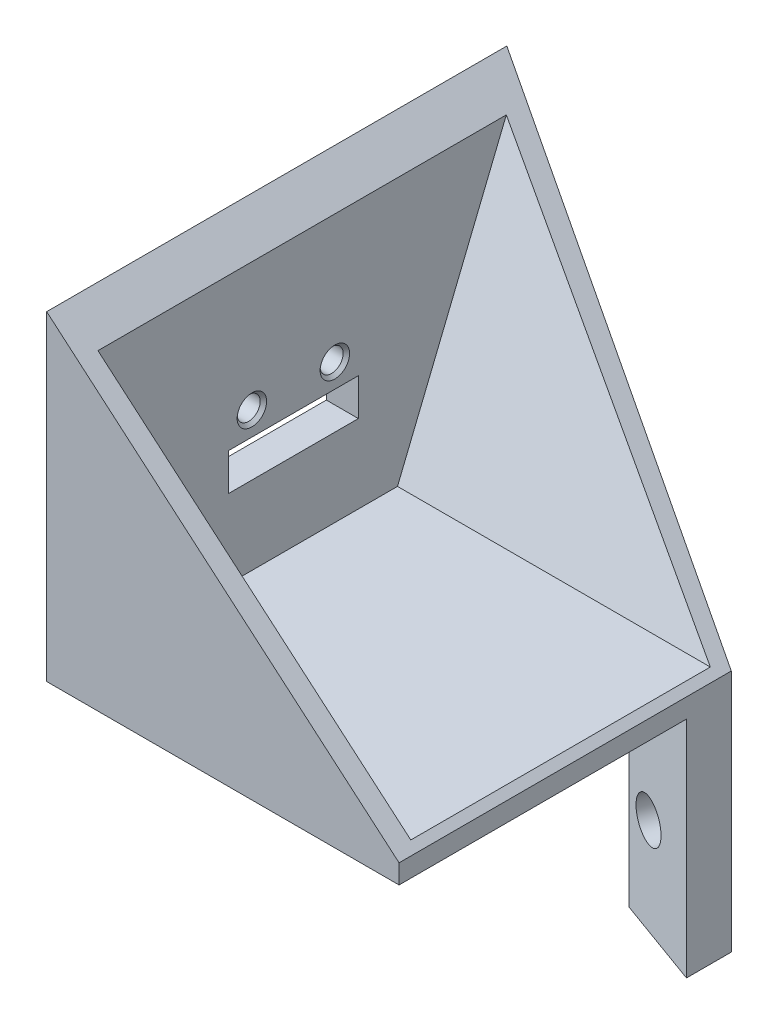
ISO-10303-21;
HEADER;
FILE_DESCRIPTION(('STEP AP214'),'2;1');
FILE_NAME('part.step','',(''),(''),'','','');
FILE_SCHEMA(('AUTOMOTIVE_DESIGN { 1 0 10303 214 1 1 1 1 }'));
ENDSEC;
DATA;
#1=APPLICATION_CONTEXT('core data for automotive mechanical design processes');
#2=APPLICATION_PROTOCOL_DEFINITION('international standard','automotive_design',2000,#1);
#3=PRODUCT_CONTEXT('',#1,'mechanical');
#4=PRODUCT('Part','Part','',(#3));
#5=PRODUCT_RELATED_PRODUCT_CATEGORY('part','',(#4));
#6=PRODUCT_DEFINITION_FORMATION('','',#4);
#7=PRODUCT_DEFINITION_CONTEXT('part definition',#1,'design');
#8=PRODUCT_DEFINITION('design','',#6,#7);
#9=PRODUCT_DEFINITION_SHAPE('','',#8);
#10=(LENGTH_UNIT() NAMED_UNIT(*) SI_UNIT(.MILLI.,.METRE.));
#11=(NAMED_UNIT(*) PLANE_ANGLE_UNIT() SI_UNIT($,.RADIAN.));
#12=(NAMED_UNIT(*) SI_UNIT($,.STERADIAN.) SOLID_ANGLE_UNIT());
#13=UNCERTAINTY_MEASURE_WITH_UNIT(LENGTH_MEASURE(1.E-05),#10,'distance_accuracy_value','');
#14=(GEOMETRIC_REPRESENTATION_CONTEXT(3) GLOBAL_UNCERTAINTY_ASSIGNED_CONTEXT((#13)) GLOBAL_UNIT_ASSIGNED_CONTEXT((#10,
#11,#12)) REPRESENTATION_CONTEXT('',''));
#15=CARTESIAN_POINT('',(0.,0.,0.));
#16=DIRECTION('',(0.,0.,1.));
#17=DIRECTION('',(1.,0.,0.));
#18=AXIS2_PLACEMENT_3D('',#15,#16,#17);
#19=CARTESIAN_POINT('',(1.66533453693773E-13,1183.83508709221,0.));
#20=DIRECTION('',(0.,-1.,0.));
#21=DIRECTION('',(0.,0.,-1.));
#22=AXIS2_PLACEMENT_3D('',#19,#20,#21);
#23=PLANE('',#22);
#24=DIRECTION('',(0.940018333102236,0.,0.341123926794492));
#25=VECTOR('',#24,1.);
#26=CARTESIAN_POINT('',(-154.707254334274,1183.83508709221,426.319128959078));
#27=LINE('',#26,#25);
#28=CARTESIAN_POINT('',(1320.51130130809,1183.83508709221,961.662248193849));
#29=VERTEX_POINT('',#28);
#30=CARTESIAN_POINT('',(1334.61157630462,1183.83508709221,966.779107095766));
#31=VERTEX_POINT('',#30);
#32=EDGE_CURVE('E186',#29,#31,#27,.T.);
#33=ORIENTED_EDGE('',*,*,#32,.T.);
#34=DIRECTION('',(0.,0.,-1.));
#35=VECTOR('',#34,1.);
#36=CARTESIAN_POINT('',(1334.61157630462,1183.83508709221,0.));
#37=LINE('',#36,#35);
#38=CARTESIAN_POINT('',(1334.61157630462,1183.83508709221,959.779107095766));
#39=VERTEX_POINT('',#38);
#40=EDGE_CURVE('E66',#31,#39,#37,.T.);
#41=ORIENTED_EDGE('',*,*,#40,.T.);
#42=DIRECTION('',(-0.940018333102236,0.,-0.341123926794492));
#43=VECTOR('',#42,1.);
#44=CARTESIAN_POINT('',(1375.51130130809,1183.83508709221,974.621237623107));
#45=LINE('',#44,#43);
#46=CARTESIAN_POINT('',(1361.41102631155,1183.83508709221,969.50437872119));
#47=VERTEX_POINT('',#46);
#48=EDGE_CURVE('E327',#47,#39,#45,.T.);
#49=ORIENTED_EDGE('',*,*,#48,.F.);
#50=DIRECTION('',(0.,0.,-1.));
#51=VECTOR('',#50,1.);
#52=CARTESIAN_POINT('',(1361.41102631155,1183.83508709221,0.));
#53=LINE('',#52,#51);
#54=CARTESIAN_POINT('',(1361.41102631155,1183.83508709221,976.50437872119));
#55=VERTEX_POINT('',#54);
#56=EDGE_CURVE('E71',#55,#47,#53,.T.);
#57=ORIENTED_EDGE('',*,*,#56,.F.);
#58=DIRECTION('',(-0.940018333102236,0.,-0.341123926794492));
#59=VECTOR('',#58,1.);
#60=CARTESIAN_POINT('',(-154.707254334274,1183.83508709221,426.319128959078));
#61=LINE('',#60,#59);
#62=CARTESIAN_POINT('',(1375.51130130809,1183.83508709221,981.621237623107));
#63=VERTEX_POINT('',#62);
#64=EDGE_CURVE('E180',#63,#55,#61,.T.);
#65=ORIENTED_EDGE('',*,*,#64,.F.);
#66=DIRECTION('',(0.,0.,-1.));
#67=VECTOR('',#66,1.);
#68=CARTESIAN_POINT('',(1375.51130130809,1183.83508709221,1026.47670177833));
#69=LINE('',#68,#67);
#70=CARTESIAN_POINT('',(1375.51130130809,1183.83508709221,1026.47670177833));
#71=VERTEX_POINT('',#70);
#72=EDGE_CURVE('E331',#71,#63,#69,.T.);
#73=ORIENTED_EDGE('',*,*,#72,.F.);
#74=DIRECTION('',(-1.,0.,0.));
#75=VECTOR('',#74,1.);
#76=CARTESIAN_POINT('',(1325.51130130809,1183.83508709221,1026.47670177833));
#77=LINE('',#76,#75);
#78=CARTESIAN_POINT('',(1320.51130130809,1183.83508709221,1026.47670177833));
#79=VERTEX_POINT('',#78);
#80=EDGE_CURVE('E329',#71,#79,#77,.T.);
#81=ORIENTED_EDGE('',*,*,#80,.T.);
#82=DIRECTION('',(0.,0.,-1.));
#83=VECTOR('',#82,1.);
#84=CARTESIAN_POINT('',(1320.51130130809,1183.83508709221,1026.47670177833));
#85=LINE('',#84,#83);
#86=EDGE_CURVE('E322',#79,#29,#85,.T.);
#87=ORIENTED_EDGE('',*,*,#86,.T.);
#88=EDGE_LOOP('',(#33,#41,#49,#57,#65,#73,#81,#87));
#89=FACE_BOUND('',#88,.T.);
#90=ADVANCED_FACE('F47',(#89),#23,.T.);
#91=CARTESIAN_POINT('',(1320.51130130809,1183.83508709221,1026.47670177833));
#92=DIRECTION('',(1.,0.,0.));
#93=DIRECTION('',(0.,1.,0.));
#94=AXIS2_PLACEMENT_3D('',#91,#92,#93);
#95=PLANE('',#94);
#96=DIRECTION('',(0.,0.,-1.));
#97=VECTOR('',#96,1.);
#98=CARTESIAN_POINT('',(1320.51130130809,1233.83508709221,1026.47670177833));
#99=LINE('',#98,#97);
#100=CARTESIAN_POINT('',(1320.51130130809,1233.83508709221,1026.47670177833));
#101=VERTEX_POINT('',#100);
#102=CARTESIAN_POINT('',(1320.51130130809,1233.83508709221,954.662248193849));
#103=VERTEX_POINT('',#102);
#104=EDGE_CURVE('E323',#101,#103,#99,.T.);
#105=ORIENTED_EDGE('',*,*,#104,.T.);
#106=DIRECTION('',(0.,-1.,0.));
#107=VECTOR('',#106,1.);
#108=CARTESIAN_POINT('',(1320.51130130809,1237.85655253535,954.662248193849));
#109=LINE('',#108,#107);
#110=CARTESIAN_POINT('',(1320.51130130809,1148.83508709221,954.662248193848));
#111=VERTEX_POINT('',#110);
#112=EDGE_CURVE('E245',#103,#111,#109,.T.);
#113=ORIENTED_EDGE('',*,*,#112,.T.);
#114=DIRECTION('',(0.,0.,-1.));
#115=VECTOR('',#114,1.);
#116=CARTESIAN_POINT('',(1320.51130130809,1148.83508709221,0.));
#117=LINE('',#116,#115);
#118=CARTESIAN_POINT('',(1320.51130130809,1148.83508709221,961.662248193849));
#119=VERTEX_POINT('',#118);
#120=EDGE_CURVE('E193',#119,#111,#117,.T.);
#121=ORIENTED_EDGE('',*,*,#120,.F.);
#122=DIRECTION('',(0.,1.,0.));
#123=VECTOR('',#122,1.);
#124=CARTESIAN_POINT('',(1320.51130130809,1148.83508709221,961.662248193849));
#125=LINE('',#124,#123);
#126=EDGE_CURVE('E178',#119,#29,#125,.T.);
#127=ORIENTED_EDGE('',*,*,#126,.T.);
#128=ORIENTED_EDGE('',*,*,#86,.F.);
#129=DIRECTION('',(0.,1.,0.));
#130=VECTOR('',#129,1.);
#131=CARTESIAN_POINT('',(1320.51130130809,1183.83508709221,1026.47670177833));
#132=LINE('',#131,#130);
#133=EDGE_CURVE('E339',#79,#101,#132,.T.);
#134=ORIENTED_EDGE('',*,*,#133,.T.);
#135=EDGE_LOOP('',(#105,#113,#121,#127,#128,#134));
#136=FACE_BOUND('',#135,.T.);
#137=CARTESIAN_POINT('',(1320.51130130809,1209.54235981948,986.501701778326));
#138=DIRECTION('',(1.,0.,0.));
#139=DIRECTION('',(0.,0.,-1.));
#140=AXIS2_PLACEMENT_3D('',#137,#138,#139);
#141=CIRCLE('',#140,1.79999999999998);
#142=CARTESIAN_POINT('',(1320.51130130809,1209.54235981948,984.701701778327));
#143=VERTEX_POINT('',#142);
#144=EDGE_CURVE('E277',#143,#143,#141,.F.);
#145=ORIENTED_EDGE('',*,*,#144,.F.);
#146=EDGE_LOOP('',(#145));
#147=FACE_BOUND('',#146,.T.);
#148=DIRECTION('',(0.,-1.,0.));
#149=VECTOR('',#148,1.);
#150=CARTESIAN_POINT('',(1320.51130130809,0.,982.826701778326));
#151=LINE('',#150,#149);
#152=CARTESIAN_POINT('',(1320.51130130809,1205.85735981948,982.826701778326));
#153=VERTEX_POINT('',#152);
#154=CARTESIAN_POINT('',(1320.51130130809,1200.05735981948,982.826701778326));
#155=VERTEX_POINT('',#154);
#156=EDGE_CURVE('E246',#153,#155,#151,.T.);
#157=ORIENTED_EDGE('',*,*,#156,.F.);
#158=DIRECTION('',(0.,0.,-1.));
#159=VECTOR('',#158,1.);
#160=CARTESIAN_POINT('',(1320.51130130809,1205.85735981948,0.));
#161=LINE('',#160,#159);
#162=CARTESIAN_POINT('',(1320.51130130809,1205.85735981948,1003.12670177833));
#163=VERTEX_POINT('',#162);
#164=EDGE_CURVE('E248',#163,#153,#161,.T.);
#165=ORIENTED_EDGE('',*,*,#164,.F.);
#166=DIRECTION('',(0.,-1.,0.));
#167=VECTOR('',#166,1.);
#168=CARTESIAN_POINT('',(1320.51130130809,0.,1003.12670177833));
#169=LINE('',#168,#167);
#170=CARTESIAN_POINT('',(1320.51130130809,1200.05735981948,1003.12670177833));
#171=VERTEX_POINT('',#170);
#172=EDGE_CURVE('E254',#163,#171,#169,.T.);
#173=ORIENTED_EDGE('',*,*,#172,.T.);
#174=DIRECTION('',(0.,0.,-1.));
#175=VECTOR('',#174,1.);
#176=CARTESIAN_POINT('',(1320.51130130809,1200.05735981948,0.));
#177=LINE('',#176,#175);
#178=EDGE_CURVE('E256',#171,#155,#177,.T.);
#179=ORIENTED_EDGE('',*,*,#178,.T.);
#180=EDGE_LOOP('',(#157,#165,#173,#179));
#181=FACE_BOUND('',#180,.T.);
#182=CARTESIAN_POINT('',(1320.51130130809,1209.54235981948,999.451701778327));
#183=DIRECTION('',(1.,0.,0.));
#184=DIRECTION('',(0.,0.,-1.));
#185=AXIS2_PLACEMENT_3D('',#182,#183,#184);
#186=CIRCLE('',#185,1.79999999999998);
#187=CARTESIAN_POINT('',(1320.51130130809,1209.54235981948,997.651701778326));
#188=VERTEX_POINT('',#187);
#189=EDGE_CURVE('E244',#188,#188,#186,.T.);
#190=ORIENTED_EDGE('',*,*,#189,.T.);
#191=EDGE_LOOP('',(#190));
#192=FACE_BOUND('',#191,.T.);
#193=ADVANCED_FACE('F410',(#136,#147,#181,#192),#95,.F.);
#194=CARTESIAN_POINT('',(1325.51130130809,1187.83508709221,0.));
#195=DIRECTION('',(-1.,0.,0.));
#196=DIRECTION('',(0.,0.,1.));
#197=AXIS2_PLACEMENT_3D('',#194,#195,#196);
#198=PLANE('',#197);
#199=CARTESIAN_POINT('',(1325.51130130809,1209.54235981948,999.451701778327));
#200=DIRECTION('',(-1.,0.,0.));
#201=DIRECTION('',(0.,0.,1.));
#202=AXIS2_PLACEMENT_3D('',#199,#200,#201);
#203=CIRCLE('',#202,2.29999999999964);
#204=CARTESIAN_POINT('',(1325.51130130809,1209.54235981948,1001.75170177833));
#205=VERTEX_POINT('',#204);
#206=EDGE_CURVE('E56',#205,#205,#203,.T.);
#207=ORIENTED_EDGE('',*,*,#206,.T.);
#208=EDGE_LOOP('',(#207));
#209=FACE_BOUND('',#208,.T.);
#210=CARTESIAN_POINT('',(1325.51130130809,1209.54235981948,986.501701778326));
#211=DIRECTION('',(-1.,0.,0.));
#212=DIRECTION('',(0.,0.,1.));
#213=AXIS2_PLACEMENT_3D('',#210,#211,#212);
#214=CIRCLE('',#213,2.29999999999997);
#215=CARTESIAN_POINT('',(1325.51130130809,1209.54235981948,988.801701778326));
#216=VERTEX_POINT('',#215);
#217=EDGE_CURVE('E381',#216,#216,#214,.T.);
#218=ORIENTED_EDGE('',*,*,#217,.T.);
#219=EDGE_LOOP('',(#218));
#220=FACE_BOUND('',#219,.T.);
#221=DIRECTION('',(0.,1.,0.));
#222=VECTOR('',#221,1.);
#223=CARTESIAN_POINT('',(1325.51130130809,1187.83508709221,1023.47670177833));
#224=LINE('',#223,#222);
#225=CARTESIAN_POINT('',(1325.51130130809,1187.83508709221,1023.47670177833));
#226=VERTEX_POINT('',#225);
#227=CARTESIAN_POINT('',(1325.51130130809,1229.56235981948,1023.47670177833));
#228=VERTEX_POINT('',#227);
#229=EDGE_CURVE('E311',#226,#228,#224,.T.);
#230=ORIENTED_EDGE('',*,*,#229,.F.);
#231=DIRECTION('',(0.,0.,1.));
#232=VECTOR('',#231,1.);
#233=CARTESIAN_POINT('',(1325.51130130809,1187.83508709221,0.));
#234=LINE('',#233,#232);
#235=CARTESIAN_POINT('',(1325.51130130809,1187.83508709221,976.723992590761));
#236=VERTEX_POINT('',#235);
#237=EDGE_CURVE('E310',#236,#226,#234,.T.);
#238=ORIENTED_EDGE('',*,*,#237,.F.);
#239=DIRECTION('',(0.,0.926185450497619,-0.377068311167251));
#240=VECTOR('',#239,1.);
#241=CARTESIAN_POINT('',(1325.51130130809,1187.83508709221,976.723992590761));
#242=LINE('',#241,#240);
#243=CARTESIAN_POINT('',(1325.51130130809,1229.56235981948,959.735999259151));
#244=VERTEX_POINT('',#243);
#245=EDGE_CURVE('E298',#236,#244,#242,.T.);
#246=ORIENTED_EDGE('',*,*,#245,.T.);
#247=DIRECTION('',(0.,0.,-1.));
#248=VECTOR('',#247,1.);
#249=CARTESIAN_POINT('',(1325.51130130809,1229.56235981948,956.476701778327));
#250=LINE('',#249,#248);
#251=EDGE_CURVE('E346',#228,#244,#250,.T.);
#252=ORIENTED_EDGE('',*,*,#251,.F.);
#253=EDGE_LOOP('',(#230,#238,#246,#252));
#254=FACE_BOUND('',#253,.T.);
#255=DIRECTION('',(0.,-1.,0.));
#256=VECTOR('',#255,1.);
#257=CARTESIAN_POINT('',(1325.51130130809,0.,982.826701778326));
#258=LINE('',#257,#256);
#259=CARTESIAN_POINT('',(1325.51130130809,1205.85735981948,982.826701778326));
#260=VERTEX_POINT('',#259);
#261=CARTESIAN_POINT('',(1325.51130130809,1200.05735981948,982.826701778326));
#262=VERTEX_POINT('',#261);
#263=EDGE_CURVE('E265',#260,#262,#258,.T.);
#264=ORIENTED_EDGE('',*,*,#263,.T.);
#265=DIRECTION('',(0.,0.,-1.));
#266=VECTOR('',#265,1.);
#267=CARTESIAN_POINT('',(1325.51130130809,1200.05735981948,0.));
#268=LINE('',#267,#266);
#269=CARTESIAN_POINT('',(1325.51130130809,1200.05735981948,1003.12670177833));
#270=VERTEX_POINT('',#269);
#271=EDGE_CURVE('E249',#270,#262,#268,.T.);
#272=ORIENTED_EDGE('',*,*,#271,.F.);
#273=DIRECTION('',(0.,-1.,0.));
#274=VECTOR('',#273,1.);
#275=CARTESIAN_POINT('',(1325.51130130809,0.,1003.12670177833));
#276=LINE('',#275,#274);
#277=CARTESIAN_POINT('',(1325.51130130809,1205.85735981948,1003.12670177833));
#278=VERTEX_POINT('',#277);
#279=EDGE_CURVE('E268',#278,#270,#276,.T.);
#280=ORIENTED_EDGE('',*,*,#279,.F.);
#281=DIRECTION('',(0.,0.,-1.));
#282=VECTOR('',#281,1.);
#283=CARTESIAN_POINT('',(1325.51130130809,1205.85735981948,0.));
#284=LINE('',#283,#282);
#285=EDGE_CURVE('E267',#278,#260,#284,.T.);
#286=ORIENTED_EDGE('',*,*,#285,.T.);
#287=EDGE_LOOP('',(#264,#272,#280,#286));
#288=FACE_BOUND('',#287,.T.);
#289=ADVANCED_FACE('F391',(#209,#220,#254,#288),#198,.F.);
#290=CARTESIAN_POINT('',(1166.69338263716,1365.27949032009,956.476701778327));
#291=DIRECTION('',(-0.649652327582145,-0.760231447170598,0.));
#292=DIRECTION('',(0.760231447170598,-0.649652327582145,0.));
#293=AXIS2_PLACEMENT_3D('',#290,#291,#292);
#294=PLANE('',#293);
#295=DIRECTION('',(-0.732853958755243,0.626257019299932,-0.265945898472479));
#296=VECTOR('',#295,1.);
#297=CARTESIAN_POINT('',(1376.88816611546,1185.65849352954,975.120889080124));
#298=LINE('',#297,#296);
#299=CARTESIAN_POINT('',(1375.51130130809,1186.83508709221,974.621237623107));
#300=VERTEX_POINT('',#299);
#301=EDGE_CURVE('E318',#300,#103,#298,.T.);
#302=ORIENTED_EDGE('',*,*,#301,.T.);
#303=ORIENTED_EDGE('',*,*,#104,.F.);
#304=DIRECTION('',(0.760231447170598,-0.649652327582145,0.));
#305=VECTOR('',#304,1.);
#306=CARTESIAN_POINT('',(1348.0953670322,1210.26324910978,1026.47670177833));
#307=LINE('',#306,#305);
#308=CARTESIAN_POINT('',(1375.51130130809,1186.83508709221,1026.47670177833));
#309=VERTEX_POINT('',#308);
#310=EDGE_CURVE('E314',#101,#309,#307,.T.);
#311=ORIENTED_EDGE('',*,*,#310,.T.);
#312=DIRECTION('',(0.,0.,1.));
#313=VECTOR('',#312,1.);
#314=CARTESIAN_POINT('',(1375.51130130809,1186.83508709221,956.476701778327));
#315=LINE('',#314,#313);
#316=EDGE_CURVE('E317',#300,#309,#315,.T.);
#317=ORIENTED_EDGE('',*,*,#316,.F.);
#318=EDGE_LOOP('',(#302,#303,#311,#317));
#319=FACE_BOUND('',#318,.T.);
#320=DIRECTION('',(-0.734959632084874,0.628056412872526,-0.255694116974486));
#321=VECTOR('',#320,1.);
#322=CARTESIAN_POINT('',(1176.46431280201,1356.92978636103,907.882215119117));
#323=LINE('',#322,#321);
#324=CARTESIAN_POINT('',(1374.34108854213,1187.83508709221,976.723992590761));
#325=VERTEX_POINT('',#324);
#326=EDGE_CURVE('E368',#325,#244,#323,.T.);
#327=ORIENTED_EDGE('',*,*,#326,.F.);
#328=DIRECTION('',(0.,0.,1.));
#329=VECTOR('',#328,1.);
#330=CARTESIAN_POINT('',(1374.34108854213,1187.83508709221,956.476701778327));
#331=LINE('',#330,#329);
#332=CARTESIAN_POINT('',(1374.34108854213,1187.83508709221,1023.47670177833));
#333=VERTEX_POINT('',#332);
#334=EDGE_CURVE('E364',#325,#333,#331,.T.);
#335=ORIENTED_EDGE('',*,*,#334,.T.);
#336=DIRECTION('',(-0.760231447170598,0.649652327582145,0.));
#337=VECTOR('',#336,1.);
#338=CARTESIAN_POINT('',(1166.69338263716,1365.27949032009,1023.47670177833));
#339=LINE('',#338,#337);
#340=EDGE_CURVE('E359',#333,#228,#339,.T.);
#341=ORIENTED_EDGE('',*,*,#340,.T.);
#342=ORIENTED_EDGE('',*,*,#251,.T.);
#343=EDGE_LOOP('',(#327,#335,#341,#342));
#344=FACE_BOUND('',#343,.T.);
#345=ADVANCED_FACE('F419',(#319,#344),#294,.F.);
#346=CARTESIAN_POINT('',(1375.51130130809,1183.83508709221,1026.47670177833));
#347=DIRECTION('',(1.,0.,0.));
#348=DIRECTION('',(0.,0.,-1.));
#349=AXIS2_PLACEMENT_3D('',#346,#347,#348);
#350=PLANE('',#349);
#351=DIRECTION('',(0.,1.,0.));
#352=VECTOR('',#351,1.);
#353=CARTESIAN_POINT('',(1375.51130130809,1183.83508709221,974.621237623107));
#354=LINE('',#353,#352);
#355=CARTESIAN_POINT('',(1375.51130130809,1148.83508709221,974.621237623107));
#356=VERTEX_POINT('',#355);
#357=EDGE_CURVE('E333',#356,#300,#354,.T.);
#358=ORIENTED_EDGE('',*,*,#357,.T.);
#359=ORIENTED_EDGE('',*,*,#316,.T.);
#360=DIRECTION('',(0.,-1.,0.));
#361=VECTOR('',#360,1.);
#362=CARTESIAN_POINT('',(1375.51130130809,1183.83508709221,1026.47670177833));
#363=LINE('',#362,#361);
#364=EDGE_CURVE('E338',#71,#309,#363,.F.);
#365=ORIENTED_EDGE('',*,*,#364,.F.);
#366=ORIENTED_EDGE('',*,*,#72,.T.);
#367=DIRECTION('',(0.,1.,0.));
#368=VECTOR('',#367,1.);
#369=CARTESIAN_POINT('',(1375.51130130809,1148.83508709221,981.621237623107));
#370=LINE('',#369,#368);
#371=CARTESIAN_POINT('',(1375.51130130809,1148.83508709221,981.621237623107));
#372=VERTEX_POINT('',#371);
#373=EDGE_CURVE('E228',#372,#63,#370,.T.);
#374=ORIENTED_EDGE('',*,*,#373,.F.);
#375=DIRECTION('',(0.,0.,1.));
#376=VECTOR('',#375,1.);
#377=CARTESIAN_POINT('',(1375.51130130808,1148.83508709221,-5.8899263258861E-12));
#378=LINE('',#377,#376);
#379=EDGE_CURVE('E225',#356,#372,#378,.T.);
#380=ORIENTED_EDGE('',*,*,#379,.F.);
#381=EDGE_LOOP('',(#358,#359,#365,#366,#374,#380));
#382=FACE_BOUND('',#381,.T.);
#383=ADVANCED_FACE('F431',(#382),#350,.T.);
#384=CARTESIAN_POINT('',(1375.51130130809,1183.83508709221,974.621237623107));
#385=DIRECTION('',(0.341123926794492,0.,-0.940018333102236));
#386=DIRECTION('',(-0.940018333102236,0.,-0.341123926794492));
#387=AXIS2_PLACEMENT_3D('',#384,#385,#386);
#388=PLANE('',#387);
#389=CARTESIAN_POINT('',(1368.46116380982,1163.83508709221,972.062808172149));
#390=DIRECTION('',(0.341123926794492,0.,-0.940018333102236));
#391=DIRECTION('',(-0.940018333102236,0.,-0.341123926794492));
#392=AXIS2_PLACEMENT_3D('',#389,#390,#391);
#393=CIRCLE('',#392,3.25400000000001);
#394=CARTESIAN_POINT('',(1365.40234415391,1163.83508709221,970.95279091436));
#395=VERTEX_POINT('',#394);
#396=EDGE_CURVE('E380',#395,#395,#393,.T.);
#397=ORIENTED_EDGE('',*,*,#396,.F.);
#398=EDGE_LOOP('',(#397));
#399=FACE_BOUND('',#398,.T.);
#400=CARTESIAN_POINT('',(1327.56143880635,1163.83508709221,957.220677644807));
#401=DIRECTION('',(0.341123926794492,0.,-0.940018333102236));
#402=DIRECTION('',(-0.940018333102236,0.,-0.341123926794492));
#403=AXIS2_PLACEMENT_3D('',#400,#401,#402);
#404=CIRCLE('',#403,3.25400000000041);
#405=CARTESIAN_POINT('',(1324.50261915044,1163.83508709221,956.110660387018));
#406=VERTEX_POINT('',#405);
#407=EDGE_CURVE('E533',#406,#406,#404,.T.);
#408=ORIENTED_EDGE('',*,*,#407,.F.);
#409=EDGE_LOOP('',(#408));
#410=FACE_BOUND('',#409,.T.);
#411=ORIENTED_EDGE('',*,*,#301,.F.);
#412=ORIENTED_EDGE('',*,*,#357,.F.);
#413=DIRECTION('',(0.940018333102236,0.,0.341123926794492));
#414=VECTOR('',#413,1.);
#415=CARTESIAN_POINT('',(-152.462615118948,1148.83508709221,420.1336876931));
#416=LINE('',#415,#414);
#417=CARTESIAN_POINT('',(1361.41102631155,1148.83508709221,969.50437872119));
#418=VERTEX_POINT('',#417);
#419=EDGE_CURVE('E217',#418,#356,#416,.T.);
#420=ORIENTED_EDGE('',*,*,#419,.F.);
#421=DIRECTION('',(0.,1.,0.));
#422=VECTOR('',#421,1.);
#423=CARTESIAN_POINT('',(1361.41102631155,1148.83508709221,969.50437872119));
#424=LINE('',#423,#422);
#425=EDGE_CURVE('E232',#418,#47,#424,.T.);
#426=ORIENTED_EDGE('',*,*,#425,.T.);
#427=ORIENTED_EDGE('',*,*,#48,.T.);
#428=DIRECTION('',(0.,1.,0.));
#429=VECTOR('',#428,1.);
#430=CARTESIAN_POINT('',(1334.61157630462,1148.83508709221,959.779107095766));
#431=LINE('',#430,#429);
#432=CARTESIAN_POINT('',(1334.61157630462,1148.83508709221,959.779107095766));
#433=VERTEX_POINT('',#432);
#434=EDGE_CURVE('E204',#433,#39,#431,.T.);
#435=ORIENTED_EDGE('',*,*,#434,.F.);
#436=DIRECTION('',(0.940018333102236,0.,0.341123926794492));
#437=VECTOR('',#436,1.);
#438=CARTESIAN_POINT('',(-152.462615118948,1148.83508709221,420.1336876931));
#439=LINE('',#438,#437);
#440=EDGE_CURVE('E187',#111,#433,#439,.T.);
#441=ORIENTED_EDGE('',*,*,#440,.F.);
#442=ORIENTED_EDGE('',*,*,#112,.F.);
#443=EDGE_LOOP('',(#411,#412,#420,#426,#427,#435,#441,#442));
#444=FACE_BOUND('',#443,.T.);
#445=ADVANCED_FACE('F422',(#399,#410,#444),#388,.T.);
#446=CARTESIAN_POINT('',(1325.51130130809,1183.83508709221,1026.47670177833));
#447=DIRECTION('',(0.,0.,1.));
#448=DIRECTION('',(0.,-1.,0.));
#449=AXIS2_PLACEMENT_3D('',#446,#447,#448);
#450=PLANE('',#449);
#451=ORIENTED_EDGE('',*,*,#310,.F.);
#452=ORIENTED_EDGE('',*,*,#133,.F.);
#453=ORIENTED_EDGE('',*,*,#80,.F.);
#454=ORIENTED_EDGE('',*,*,#364,.T.);
#455=EDGE_LOOP('',(#451,#452,#453,#454));
#456=FACE_BOUND('',#455,.T.);
#457=ADVANCED_FACE('F427',(#456),#450,.T.);
#458=CARTESIAN_POINT('',(0.,1187.83508709221,1023.47670177833));
#459=DIRECTION('',(0.,0.,1.));
#460=DIRECTION('',(1.,0.,0.));
#461=AXIS2_PLACEMENT_3D('',#458,#459,#460);
#462=PLANE('',#461);
#463=ORIENTED_EDGE('',*,*,#340,.F.);
#464=DIRECTION('',(1.,0.,0.));
#465=VECTOR('',#464,1.);
#466=CARTESIAN_POINT('',(0.,1187.83508709221,1023.47670177833));
#467=LINE('',#466,#465);
#468=EDGE_CURVE('E302',#226,#333,#467,.T.);
#469=ORIENTED_EDGE('',*,*,#468,.F.);
#470=ORIENTED_EDGE('',*,*,#229,.T.);
#471=EDGE_LOOP('',(#463,#469,#470));
#472=FACE_BOUND('',#471,.T.);
#473=ADVANCED_FACE('F440',(#472),#462,.F.);
#474=CARTESIAN_POINT('',(0.,1187.83508709221,0.));
#475=DIRECTION('',(0.,-1.,0.));
#476=DIRECTION('',(0.,0.,-1.));
#477=AXIS2_PLACEMENT_3D('',#474,#475,#476);
#478=PLANE('',#477);
#479=DIRECTION('',(-1.,0.,0.));
#480=VECTOR('',#479,1.);
#481=CARTESIAN_POINT('',(-2.30719460697459E-12,1187.83508709221,976.723992590758));
#482=LINE('',#481,#480);
#483=EDGE_CURVE('E297',#325,#236,#482,.T.);
#484=ORIENTED_EDGE('',*,*,#483,.T.);
#485=ORIENTED_EDGE('',*,*,#237,.T.);
#486=ORIENTED_EDGE('',*,*,#468,.T.);
#487=ORIENTED_EDGE('',*,*,#334,.F.);
#488=EDGE_LOOP('',(#484,#485,#486,#487));
#489=FACE_BOUND('',#488,.T.);
#490=ADVANCED_FACE('F443',(#489),#478,.F.);
#491=CARTESIAN_POINT('',(1420.5641281527,1187.83508709221,976.723992590761));
#492=DIRECTION('',(0.,0.377068311167251,0.926185450497619));
#493=DIRECTION('',(0.,-0.926185450497619,0.377068311167251));
#494=AXIS2_PLACEMENT_3D('',#491,#492,#493);
#495=PLANE('',#494);
#496=ORIENTED_EDGE('',*,*,#326,.T.);
#497=ORIENTED_EDGE('',*,*,#245,.F.);
#498=ORIENTED_EDGE('',*,*,#483,.F.);
#499=EDGE_LOOP('',(#496,#497,#498));
#500=FACE_BOUND('',#499,.T.);
#501=ADVANCED_FACE('F446',(#500),#495,.T.);
#502=CARTESIAN_POINT('',(1320.51130130809,1209.54235981948,986.501701778326));
#503=DIRECTION('',(1.,0.,0.));
#504=DIRECTION('',(0.,0.,-1.));
#505=AXIS2_PLACEMENT_3D('',#502,#503,#504);
#506=CYLINDRICAL_SURFACE('',#505,1.79999999999998);
#507=CARTESIAN_POINT('',(1325.01130130809,1209.54235981948,986.501701778326));
#508=DIRECTION('',(-1.,0.,0.));
#509=DIRECTION('',(0.,0.,1.));
#510=AXIS2_PLACEMENT_3D('',#507,#508,#509);
#511=CIRCLE('',#510,1.79999999999998);
#512=CARTESIAN_POINT('',(1325.01130130809,1209.54235981948,988.301701778327));
#513=VERTEX_POINT('',#512);
#514=EDGE_CURVE('E11',#513,#513,#511,.F.);
#515=ORIENTED_EDGE('',*,*,#514,.T.);
#516=EDGE_LOOP('',(#515));
#517=FACE_BOUND('',#516,.T.);
#518=ORIENTED_EDGE('',*,*,#144,.T.);
#519=EDGE_LOOP('',(#518));
#520=FACE_BOUND('',#519,.T.);
#521=ADVANCED_FACE('F455',(#517,#520),#506,.F.);
#522=CARTESIAN_POINT('',(1320.51130130809,0.,982.826701778326));
#523=DIRECTION('',(0.,0.,1.));
#524=DIRECTION('',(1.,0.,0.));
#525=AXIS2_PLACEMENT_3D('',#522,#523,#524);
#526=PLANE('',#525);
#527=ORIENTED_EDGE('',*,*,#263,.F.);
#528=DIRECTION('',(1.,0.,0.));
#529=VECTOR('',#528,1.);
#530=CARTESIAN_POINT('',(1320.51130130809,1205.85735981948,982.826701778326));
#531=LINE('',#530,#529);
#532=EDGE_CURVE('E261',#153,#260,#531,.T.);
#533=ORIENTED_EDGE('',*,*,#532,.F.);
#534=ORIENTED_EDGE('',*,*,#156,.T.);
#535=DIRECTION('',(1.,0.,0.));
#536=VECTOR('',#535,1.);
#537=CARTESIAN_POINT('',(1320.51130130809,1200.05735981948,982.826701778326));
#538=LINE('',#537,#536);
#539=EDGE_CURVE('E276',#155,#262,#538,.T.);
#540=ORIENTED_EDGE('',*,*,#539,.T.);
#541=EDGE_LOOP('',(#527,#533,#534,#540));
#542=FACE_BOUND('',#541,.T.);
#543=ADVANCED_FACE('F456',(#542),#526,.T.);
#544=CARTESIAN_POINT('',(1320.51130130809,1200.05735981948,0.));
#545=DIRECTION('',(0.,-1.,0.));
#546=DIRECTION('',(0.,0.,-1.));
#547=AXIS2_PLACEMENT_3D('',#544,#545,#546);
#548=PLANE('',#547);
#549=ORIENTED_EDGE('',*,*,#271,.T.);
#550=ORIENTED_EDGE('',*,*,#539,.F.);
#551=ORIENTED_EDGE('',*,*,#178,.F.);
#552=DIRECTION('',(1.,0.,0.));
#553=VECTOR('',#552,1.);
#554=CARTESIAN_POINT('',(1320.51130130809,1200.05735981948,1003.12670177833));
#555=LINE('',#554,#553);
#556=EDGE_CURVE('E281',#171,#270,#555,.T.);
#557=ORIENTED_EDGE('',*,*,#556,.T.);
#558=EDGE_LOOP('',(#549,#550,#551,#557));
#559=FACE_BOUND('',#558,.T.);
#560=ADVANCED_FACE('F462',(#559),#548,.F.);
#561=CARTESIAN_POINT('',(1320.51130130809,0.,1003.12670177833));
#562=DIRECTION('',(0.,0.,1.));
#563=DIRECTION('',(1.,0.,0.));
#564=AXIS2_PLACEMENT_3D('',#561,#562,#563);
#565=PLANE('',#564);
#566=ORIENTED_EDGE('',*,*,#279,.T.);
#567=ORIENTED_EDGE('',*,*,#556,.F.);
#568=ORIENTED_EDGE('',*,*,#172,.F.);
#569=DIRECTION('',(1.,0.,0.));
#570=VECTOR('',#569,1.);
#571=CARTESIAN_POINT('',(1320.51130130809,1205.85735981948,1003.12670177833));
#572=LINE('',#571,#570);
#573=EDGE_CURVE('E282',#163,#278,#572,.T.);
#574=ORIENTED_EDGE('',*,*,#573,.T.);
#575=EDGE_LOOP('',(#566,#567,#568,#574));
#576=FACE_BOUND('',#575,.T.);
#577=ADVANCED_FACE('F463',(#576),#565,.F.);
#578=CARTESIAN_POINT('',(1320.51130130809,1205.85735981948,0.));
#579=DIRECTION('',(0.,-1.,0.));
#580=DIRECTION('',(0.,0.,-1.));
#581=AXIS2_PLACEMENT_3D('',#578,#579,#580);
#582=PLANE('',#581);
#583=ORIENTED_EDGE('',*,*,#285,.F.);
#584=ORIENTED_EDGE('',*,*,#573,.F.);
#585=ORIENTED_EDGE('',*,*,#164,.T.);
#586=ORIENTED_EDGE('',*,*,#532,.T.);
#587=EDGE_LOOP('',(#583,#584,#585,#586));
#588=FACE_BOUND('',#587,.T.);
#589=ADVANCED_FACE('F404',(#588),#582,.T.);
#590=CARTESIAN_POINT('',(1320.51130130809,1209.54235981948,999.451701778327));
#591=DIRECTION('',(1.,0.,0.));
#592=DIRECTION('',(0.,0.,-1.));
#593=AXIS2_PLACEMENT_3D('',#590,#591,#592);
#594=CYLINDRICAL_SURFACE('',#593,1.79999999999998);
#595=CARTESIAN_POINT('',(1325.01130130809,1209.54235981948,999.451701778327));
#596=DIRECTION('',(-1.,0.,0.));
#597=DIRECTION('',(0.,0.,1.));
#598=AXIS2_PLACEMENT_3D('',#595,#596,#597);
#599=CIRCLE('',#598,1.79999999999998);
#600=CARTESIAN_POINT('',(1325.01130130809,1209.54235981948,1001.25170177833));
#601=VERTEX_POINT('',#600);
#602=EDGE_CURVE('E375',#601,#601,#599,.F.);
#603=ORIENTED_EDGE('',*,*,#602,.T.);
#604=EDGE_LOOP('',(#603));
#605=FACE_BOUND('',#604,.T.);
#606=ORIENTED_EDGE('',*,*,#189,.F.);
#607=EDGE_LOOP('',(#606));
#608=FACE_BOUND('',#607,.T.);
#609=ADVANCED_FACE('F398',(#605,#608),#594,.F.);
#610=CARTESIAN_POINT('',(-154.707254334274,1148.83508709221,426.319128959078));
#611=DIRECTION('',(0.341123926794492,0.,-0.940018333102236));
#612=DIRECTION('',(-0.940018333102236,0.,-0.341123926794492));
#613=AXIS2_PLACEMENT_3D('',#610,#611,#612);
#614=PLANE('',#613);
#615=CARTESIAN_POINT('',(1366.21652459449,1163.83508709221,978.248249438127));
#616=DIRECTION('',(0.341123926794492,0.,-0.940018333102236));
#617=DIRECTION('',(-0.940018333102236,0.,-0.341123926794492));
#618=AXIS2_PLACEMENT_3D('',#615,#616,#617);
#619=CIRCLE('',#618,3.25400000000001);
#620=CARTESIAN_POINT('',(1363.15770493858,1163.83508709221,977.138232180338));
#621=VERTEX_POINT('',#620);
#622=EDGE_CURVE('E203',#621,#621,#619,.T.);
#623=ORIENTED_EDGE('',*,*,#622,.T.);
#624=EDGE_LOOP('',(#623));
#625=FACE_BOUND('',#624,.T.);
#626=ORIENTED_EDGE('',*,*,#64,.T.);
#627=DIRECTION('',(0.,1.,0.));
#628=VECTOR('',#627,1.);
#629=CARTESIAN_POINT('',(1361.41102631155,1148.83508709221,976.50437872119));
#630=LINE('',#629,#628);
#631=CARTESIAN_POINT('',(1361.41102631155,1148.83508709221,976.50437872119));
#632=VERTEX_POINT('',#631);
#633=EDGE_CURVE('E237',#632,#55,#630,.T.);
#634=ORIENTED_EDGE('',*,*,#633,.F.);
#635=DIRECTION('',(-0.940018333102236,0.,-0.341123926794492));
#636=VECTOR('',#635,1.);
#637=CARTESIAN_POINT('',(-154.707254334274,1148.83508709221,426.319128959078));
#638=LINE('',#637,#636);
#639=EDGE_CURVE('E211',#372,#632,#638,.T.);
#640=ORIENTED_EDGE('',*,*,#639,.F.);
#641=ORIENTED_EDGE('',*,*,#373,.T.);
#642=EDGE_LOOP('',(#626,#634,#640,#641));
#643=FACE_BOUND('',#642,.T.);
#644=ADVANCED_FACE('F401',(#625,#643),#614,.F.);
#645=CARTESIAN_POINT('',(1361.41102631155,1148.83508709221,0.));
#646=DIRECTION('',(1.,0.,0.));
#647=DIRECTION('',(0.,0.,-1.));
#648=AXIS2_PLACEMENT_3D('',#645,#646,#647);
#649=PLANE('',#648);
#650=ORIENTED_EDGE('',*,*,#56,.T.);
#651=ORIENTED_EDGE('',*,*,#425,.F.);
#652=DIRECTION('',(0.,0.,-1.));
#653=VECTOR('',#652,1.);
#654=CARTESIAN_POINT('',(1361.41102631155,1148.83508709221,0.));
#655=LINE('',#654,#653);
#656=EDGE_CURVE('E216',#632,#418,#655,.T.);
#657=ORIENTED_EDGE('',*,*,#656,.F.);
#658=ORIENTED_EDGE('',*,*,#633,.T.);
#659=EDGE_LOOP('',(#650,#651,#657,#658));
#660=FACE_BOUND('',#659,.T.);
#661=ADVANCED_FACE('F472',(#660),#649,.F.);
#662=CARTESIAN_POINT('',(0.,1148.83508709221,0.));
#663=DIRECTION('',(0.,-1.,0.));
#664=DIRECTION('',(0.,0.,-1.));
#665=AXIS2_PLACEMENT_3D('',#662,#663,#664);
#666=PLANE('',#665);
#667=ORIENTED_EDGE('',*,*,#639,.T.);
#668=ORIENTED_EDGE('',*,*,#656,.T.);
#669=ORIENTED_EDGE('',*,*,#419,.T.);
#670=ORIENTED_EDGE('',*,*,#379,.T.);
#671=EDGE_LOOP('',(#667,#668,#669,#670));
#672=FACE_BOUND('',#671,.T.);
#673=ADVANCED_FACE('F477',(#672),#666,.T.);
#674=CARTESIAN_POINT('',(1334.61157630462,1148.83508709221,0.));
#675=DIRECTION('',(1.,0.,0.));
#676=DIRECTION('',(0.,0.,-1.));
#677=AXIS2_PLACEMENT_3D('',#674,#675,#676);
#678=PLANE('',#677);
#679=ORIENTED_EDGE('',*,*,#40,.F.);
#680=DIRECTION('',(0.,1.,0.));
#681=VECTOR('',#680,1.);
#682=CARTESIAN_POINT('',(1334.61157630462,1148.83508709221,966.779107095766));
#683=LINE('',#682,#681);
#684=CARTESIAN_POINT('',(1334.61157630462,1148.83508709221,966.779107095766));
#685=VERTEX_POINT('',#684);
#686=EDGE_CURVE('E166',#685,#31,#683,.T.);
#687=ORIENTED_EDGE('',*,*,#686,.F.);
#688=DIRECTION('',(0.,0.,-1.));
#689=VECTOR('',#688,1.);
#690=CARTESIAN_POINT('',(1334.61157630462,1148.83508709221,0.));
#691=LINE('',#690,#689);
#692=EDGE_CURVE('E171',#685,#433,#691,.T.);
#693=ORIENTED_EDGE('',*,*,#692,.T.);
#694=ORIENTED_EDGE('',*,*,#434,.T.);
#695=EDGE_LOOP('',(#679,#687,#693,#694));
#696=FACE_BOUND('',#695,.T.);
#697=ADVANCED_FACE('F167',(#696),#678,.T.);
#698=CARTESIAN_POINT('',(-154.707254334274,1148.83508709221,426.319128959078));
#699=DIRECTION('',(-0.341123926794492,0.,0.940018333102236));
#700=DIRECTION('',(0.940018333102236,0.,0.341123926794492));
#701=AXIS2_PLACEMENT_3D('',#698,#699,#700);
#702=PLANE('',#701);
#703=CARTESIAN_POINT('',(1325.31679959103,1163.83508709221,963.406118910785));
#704=DIRECTION('',(-0.341123926794492,0.,0.940018333102236));
#705=DIRECTION('',(0.940018333102236,0.,0.341123926794492));
#706=AXIS2_PLACEMENT_3D('',#703,#704,#705);
#707=CIRCLE('',#706,3.25400000000041);
#708=CARTESIAN_POINT('',(1328.37561924694,1163.83508709221,964.516136168575));
#709=VERTEX_POINT('',#708);
#710=EDGE_CURVE('E373',#709,#709,#707,.T.);
#711=ORIENTED_EDGE('',*,*,#710,.F.);
#712=EDGE_LOOP('',(#711));
#713=FACE_BOUND('',#712,.T.);
#714=ORIENTED_EDGE('',*,*,#32,.F.);
#715=ORIENTED_EDGE('',*,*,#126,.F.);
#716=DIRECTION('',(0.940018333102236,0.,0.341123926794492));
#717=VECTOR('',#716,1.);
#718=CARTESIAN_POINT('',(-154.707254334274,1148.83508709221,426.319128959078));
#719=LINE('',#718,#717);
#720=EDGE_CURVE('E183',#119,#685,#719,.T.);
#721=ORIENTED_EDGE('',*,*,#720,.T.);
#722=ORIENTED_EDGE('',*,*,#686,.T.);
#723=EDGE_LOOP('',(#714,#715,#721,#722));
#724=FACE_BOUND('',#723,.T.);
#725=ADVANCED_FACE('F194',(#713,#724),#702,.T.);
#726=CARTESIAN_POINT('',(0.,1148.83508709221,0.));
#727=DIRECTION('',(0.,-1.,0.));
#728=DIRECTION('',(0.,0.,-1.));
#729=AXIS2_PLACEMENT_3D('',#726,#727,#728);
#730=PLANE('',#729);
#731=ORIENTED_EDGE('',*,*,#692,.F.);
#732=ORIENTED_EDGE('',*,*,#720,.F.);
#733=ORIENTED_EDGE('',*,*,#120,.T.);
#734=ORIENTED_EDGE('',*,*,#440,.T.);
#735=EDGE_LOOP('',(#731,#732,#733,#734));
#736=FACE_BOUND('',#735,.T.);
#737=ADVANCED_FACE('F185',(#736),#730,.T.);
#738=CARTESIAN_POINT('',(1304.53321898593,1163.83508709221,1020.67840402982));
#739=DIRECTION('',(0.341123926794492,0.,-0.940018333102236));
#740=DIRECTION('',(-0.940018333102236,0.,-0.341123926794492));
#741=AXIS2_PLACEMENT_3D('',#738,#739,#740);
#742=CYLINDRICAL_SURFACE('',#741,3.25400000000041);
#743=ORIENTED_EDGE('',*,*,#710,.T.);
#744=EDGE_LOOP('',(#743));
#745=FACE_BOUND('',#744,.T.);
#746=ORIENTED_EDGE('',*,*,#407,.T.);
#747=EDGE_LOOP('',(#746));
#748=FACE_BOUND('',#747,.T.);
#749=ADVANCED_FACE('F489',(#745,#748),#742,.F.);
#750=CARTESIAN_POINT('',(1345.4329439894,1163.83508709221,1035.52053455716));
#751=DIRECTION('',(0.341123926794492,0.,-0.940018333102236));
#752=DIRECTION('',(-0.940018333102236,0.,-0.341123926794492));
#753=AXIS2_PLACEMENT_3D('',#750,#751,#752);
#754=CYLINDRICAL_SURFACE('',#753,3.25400000000001);
#755=ORIENTED_EDGE('',*,*,#396,.T.);
#756=EDGE_LOOP('',(#755));
#757=FACE_BOUND('',#756,.T.);
#758=ORIENTED_EDGE('',*,*,#622,.F.);
#759=EDGE_LOOP('',(#758));
#760=FACE_BOUND('',#759,.T.);
#761=ADVANCED_FACE('F399',(#757,#760),#754,.F.);
#762=CARTESIAN_POINT('',(1325.01130130809,1209.54235981948,999.451701778327));
#763=DIRECTION('',(1.,0.,0.));
#764=DIRECTION('',(0.,0.,-1.));
#765=AXIS2_PLACEMENT_3D('',#762,#763,#764);
#766=CONICAL_SURFACE('',#765,1.79999999999998,0.78539816339738);
#767=ORIENTED_EDGE('',*,*,#206,.F.);
#768=EDGE_LOOP('',(#767));
#769=FACE_BOUND('',#768,.T.);
#770=ORIENTED_EDGE('',*,*,#602,.F.);
#771=EDGE_LOOP('',(#770));
#772=FACE_BOUND('',#771,.T.);
#773=ADVANCED_FACE('F392',(#769,#772),#766,.F.);
#774=CARTESIAN_POINT('',(1325.51130130809,1209.54235981948,986.501701778326));
#775=DIRECTION('',(1.,0.,0.));
#776=DIRECTION('',(0.,0.,-1.));
#777=AXIS2_PLACEMENT_3D('',#774,#775,#776);
#778=CONICAL_SURFACE('',#777,2.29999999999997,0.785398163397491);
#779=ORIENTED_EDGE('',*,*,#514,.F.);
#780=EDGE_LOOP('',(#779));
#781=FACE_BOUND('',#780,.T.);
#782=ORIENTED_EDGE('',*,*,#217,.F.);
#783=EDGE_LOOP('',(#782));
#784=FACE_BOUND('',#783,.T.);
#785=ADVANCED_FACE('F55',(#781,#784),#778,.F.);
#786=CLOSED_SHELL('',(#90,#193,#289,#345,#383,#445,#457,#473,#490,#501,#521,#543,#560,#577,#589,
#609,#644,#661,#673,#697,#725,#737,#749,#761,#773,#785));
#787=MANIFOLD_SOLID_BREP('B2',#786);
#788=ADVANCED_BREP_SHAPE_REPRESENTATION('',(#18,#787),#14);
#789=SHAPE_DEFINITION_REPRESENTATION(#9,#788);
ENDSEC;
END-ISO-10303-21;
